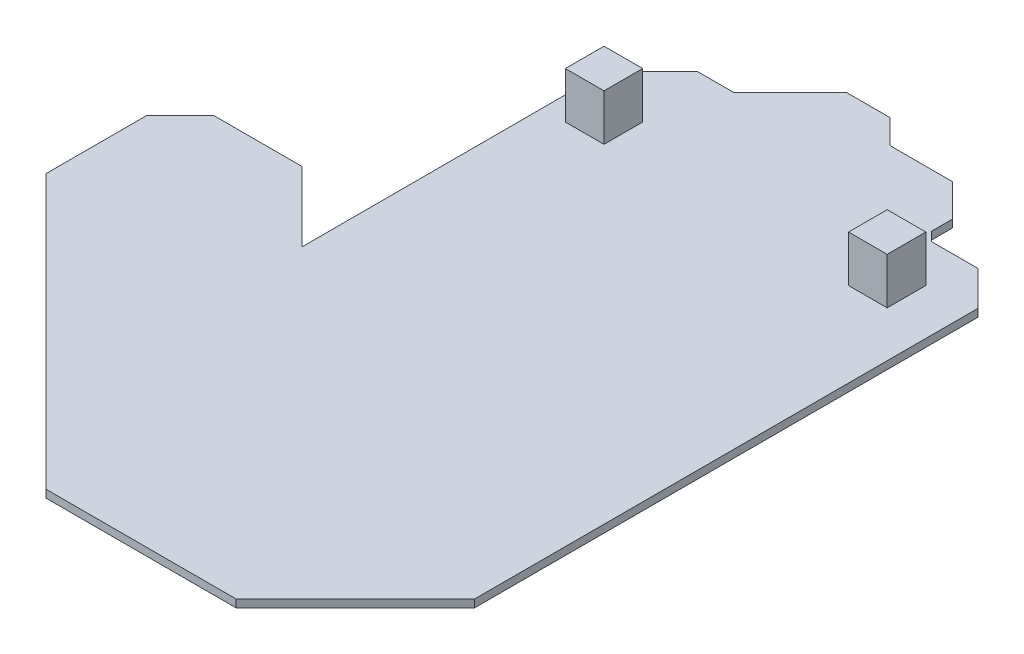
ISO-10303-21;
HEADER;
FILE_DESCRIPTION(('STEP AP214'),'2;1');
FILE_NAME('part.step','',(''),(''),'','','');
FILE_SCHEMA(('AUTOMOTIVE_DESIGN { 1 0 10303 214 1 1 1 1 }'));
ENDSEC;
DATA;
#1=APPLICATION_CONTEXT('core data for automotive mechanical design processes');
#2=APPLICATION_PROTOCOL_DEFINITION('international standard','automotive_design',2000,#1);
#3=PRODUCT_CONTEXT('',#1,'mechanical');
#4=PRODUCT('Part','Part','',(#3));
#5=PRODUCT_RELATED_PRODUCT_CATEGORY('part','',(#4));
#6=PRODUCT_DEFINITION_FORMATION('','',#4);
#7=PRODUCT_DEFINITION_CONTEXT('part definition',#1,'design');
#8=PRODUCT_DEFINITION('design','',#6,#7);
#9=PRODUCT_DEFINITION_SHAPE('','',#8);
#10=(LENGTH_UNIT() NAMED_UNIT(*) SI_UNIT(.MILLI.,.METRE.));
#11=(NAMED_UNIT(*) PLANE_ANGLE_UNIT() SI_UNIT($,.RADIAN.));
#12=(NAMED_UNIT(*) SI_UNIT($,.STERADIAN.) SOLID_ANGLE_UNIT());
#13=UNCERTAINTY_MEASURE_WITH_UNIT(LENGTH_MEASURE(1.E-05),#10,'distance_accuracy_value','');
#14=(GEOMETRIC_REPRESENTATION_CONTEXT(3) GLOBAL_UNCERTAINTY_ASSIGNED_CONTEXT((#13)) GLOBAL_UNIT_ASSIGNED_CONTEXT((#10,
#11,#12)) REPRESENTATION_CONTEXT('',''));
#15=CARTESIAN_POINT('',(0.,0.,0.));
#16=DIRECTION('',(0.,0.,1.));
#17=DIRECTION('',(1.,0.,0.));
#18=AXIS2_PLACEMENT_3D('',#15,#16,#17);
#19=CARTESIAN_POINT('',(0.,1.,0.));
#20=DIRECTION('',(0.,1.,0.));
#21=DIRECTION('',(0.,0.,1.));
#22=AXIS2_PLACEMENT_3D('',#19,#20,#21);
#23=PLANE('',#22);
#24=DIRECTION('',(0.,0.,1.));
#25=VECTOR('',#24,1.);
#26=CARTESIAN_POINT('',(-12.8081272215184,1.,-35.1234469127263));
#27=LINE('',#26,#25);
#28=CARTESIAN_POINT('',(-12.8081272215184,1.,-35.1234469127263));
#29=VERTEX_POINT('',#28);
#30=CARTESIAN_POINT('',(-12.8081272215184,1.,4.20448236548054));
#31=VERTEX_POINT('',#30);
#32=EDGE_CURVE('E301',#29,#31,#27,.T.);
#33=ORIENTED_EDGE('',*,*,#32,.T.);
#34=DIRECTION('',(-0.707106781186547,0.,-0.707106781186547));
#35=VECTOR('',#34,1.);
#36=CARTESIAN_POINT('',(-21.7959296410981,1.,-4.78332005409923));
#37=LINE('',#36,#35);
#38=CARTESIAN_POINT('',(-21.7959296410981,1.,-4.78332005409923));
#39=VERTEX_POINT('',#38);
#40=EDGE_CURVE('E305',#31,#39,#37,.T.);
#41=ORIENTED_EDGE('',*,*,#40,.T.);
#42=DIRECTION('',(-1.,0.,0.));
#43=VECTOR('',#42,1.);
#44=CARTESIAN_POINT('',(-33.2497198467111,1.,-4.78332005409923));
#45=LINE('',#44,#43);
#46=CARTESIAN_POINT('',(-33.2497198467111,1.,-4.78332005409923));
#47=VERTEX_POINT('',#46);
#48=EDGE_CURVE('E309',#39,#47,#45,.T.);
#49=ORIENTED_EDGE('',*,*,#48,.T.);
#50=DIRECTION('',(-0.707106781186548,0.,0.707106781186547));
#51=VECTOR('',#50,1.);
#52=CARTESIAN_POINT('',(-37.5858571976025,1.,-0.447182703207848));
#53=LINE('',#52,#51);
#54=CARTESIAN_POINT('',(-37.5858571976025,1.,-0.447182703207848));
#55=VERTEX_POINT('',#54);
#56=EDGE_CURVE('E312',#47,#55,#53,.T.);
#57=ORIENTED_EDGE('',*,*,#56,.T.);
#58=DIRECTION('',(0.,0.,1.));
#59=VECTOR('',#58,1.);
#60=CARTESIAN_POINT('',(-37.5858571976025,1.,12.5874570723393));
#61=LINE('',#60,#59);
#62=CARTESIAN_POINT('',(-37.5858571976025,1.,12.5874570723393));
#63=VERTEX_POINT('',#62);
#64=EDGE_CURVE('E315',#55,#63,#61,.T.);
#65=ORIENTED_EDGE('',*,*,#64,.T.);
#66=DIRECTION('',(0.707106781186547,0.,0.707106781186547));
#67=VECTOR('',#66,1.);
#68=CARTESIAN_POINT('',(-2.21140910452812,1.,47.9619051654137));
#69=LINE('',#68,#67);
#70=CARTESIAN_POINT('',(-2.21140910452812,1.,47.9619051654137));
#71=VERTEX_POINT('',#70);
#72=EDGE_CURVE('E318',#63,#71,#69,.T.);
#73=ORIENTED_EDGE('',*,*,#72,.T.);
#74=DIRECTION('',(1.,0.,0.));
#75=VECTOR('',#74,1.);
#76=CARTESIAN_POINT('',(22.3698693111261,1.,47.9619051654137));
#77=LINE('',#76,#75);
#78=CARTESIAN_POINT('',(22.3698693111261,1.,47.9619051654137));
#79=VERTEX_POINT('',#78);
#80=EDGE_CURVE('E321',#71,#79,#77,.T.);
#81=ORIENTED_EDGE('',*,*,#80,.T.);
#82=DIRECTION('',(0.707106781186547,0.,-0.707106781186548));
#83=VECTOR('',#82,1.);
#84=CARTESIAN_POINT('',(37.8255396426515,1.,32.5062348338882));
#85=LINE('',#84,#83);
#86=CARTESIAN_POINT('',(37.8255396426515,1.,32.5062348338882));
#87=VERTEX_POINT('',#86);
#88=EDGE_CURVE('E324',#79,#87,#85,.T.);
#89=ORIENTED_EDGE('',*,*,#88,.T.);
#90=DIRECTION('',(0.,0.,-1.));
#91=VECTOR('',#90,1.);
#92=CARTESIAN_POINT('',(37.8255396426515,1.,-32.6318772574283));
#93=LINE('',#92,#91);
#94=CARTESIAN_POINT('',(37.8255396426515,1.,-32.6318772574283));
#95=VERTEX_POINT('',#94);
#96=EDGE_CURVE('E327',#87,#95,#93,.T.);
#97=ORIENTED_EDGE('',*,*,#96,.T.);
#98=DIRECTION('',(-0.707106781186548,0.,-0.707106781186548));
#99=VECTOR('',#98,1.);
#100=CARTESIAN_POINT('',(33.3571241024083,1.,-37.1002927976715));
#101=LINE('',#100,#99);
#102=CARTESIAN_POINT('',(33.3571241024083,1.,-37.1002927976715));
#103=VERTEX_POINT('',#102);
#104=EDGE_CURVE('E330',#95,#103,#101,.T.);
#105=ORIENTED_EDGE('',*,*,#104,.T.);
#106=DIRECTION('',(-1.,0.,0.));
#107=VECTOR('',#106,1.);
#108=CARTESIAN_POINT('',(27.3503157601005,1.,-37.1002927976715));
#109=LINE('',#108,#107);
#110=CARTESIAN_POINT('',(27.3503157601005,1.,-37.1002927976715));
#111=VERTEX_POINT('',#110);
#112=EDGE_CURVE('E333',#103,#111,#109,.T.);
#113=ORIENTED_EDGE('',*,*,#112,.T.);
#114=DIRECTION('',(-0.707106781186548,0.,-0.707106781186548));
#115=VECTOR('',#114,1.);
#116=CARTESIAN_POINT('',(26.1749663652514,1.,-38.2756421925205));
#117=LINE('',#116,#115);
#118=CARTESIAN_POINT('',(26.1749663652514,1.,-38.2756421925205));
#119=VERTEX_POINT('',#118);
#120=EDGE_CURVE('E336',#111,#119,#117,.T.);
#121=ORIENTED_EDGE('',*,*,#120,.T.);
#122=DIRECTION('',(0.,0.,-1.));
#123=VECTOR('',#122,1.);
#124=CARTESIAN_POINT('',(26.1749663652514,1.,-40.9646260223668));
#125=LINE('',#124,#123);
#126=CARTESIAN_POINT('',(26.1749663652514,1.,-40.9646260223668));
#127=VERTEX_POINT('',#126);
#128=EDGE_CURVE('E339',#119,#127,#125,.T.);
#129=ORIENTED_EDGE('',*,*,#128,.T.);
#130=DIRECTION('',(-0.707106781186547,0.,-0.707106781186547));
#131=VECTOR('',#130,1.);
#132=CARTESIAN_POINT('',(21.9624292437838,1.,-45.1771631438344));
#133=LINE('',#132,#131);
#134=CARTESIAN_POINT('',(21.9624292437838,1.,-45.1771631438344));
#135=VERTEX_POINT('',#134);
#136=EDGE_CURVE('E342',#127,#135,#133,.T.);
#137=ORIENTED_EDGE('',*,*,#136,.T.);
#138=DIRECTION('',(-1.,0.,0.));
#139=VECTOR('',#138,1.);
#140=CARTESIAN_POINT('',(13.8722317068992,1.,-45.1771631438344));
#141=LINE('',#140,#139);
#142=CARTESIAN_POINT('',(13.8722317068992,1.,-45.1771631438344));
#143=VERTEX_POINT('',#142);
#144=EDGE_CURVE('E345',#135,#143,#141,.T.);
#145=ORIENTED_EDGE('',*,*,#144,.T.);
#146=DIRECTION('',(-0.707106781186547,0.,-0.707106781186547));
#147=VECTOR('',#146,1.);
#148=CARTESIAN_POINT('',(10.7336498927775,1.,-48.3157449579561));
#149=LINE('',#148,#147);
#150=CARTESIAN_POINT('',(10.7336498927775,1.,-48.3157449579561));
#151=VERTEX_POINT('',#150);
#152=EDGE_CURVE('E348',#143,#151,#149,.T.);
#153=ORIENTED_EDGE('',*,*,#152,.T.);
#154=DIRECTION('',(-1.,0.,0.));
#155=VECTOR('',#154,1.);
#156=CARTESIAN_POINT('',(5.11131920454483,1.,-48.3157449579561));
#157=LINE('',#156,#155);
#158=CARTESIAN_POINT('',(5.11131920454483,1.,-48.3157449579561));
#159=VERTEX_POINT('',#158);
#160=EDGE_CURVE('E351',#151,#159,#157,.T.);
#161=ORIENTED_EDGE('',*,*,#160,.T.);
#162=DIRECTION('',(-0.707106781186547,0.,0.707106781186548));
#163=VECTOR('',#162,1.);
#164=CARTESIAN_POINT('',(-2.18571472875728,1.,-41.018711024654));
#165=LINE('',#164,#163);
#166=CARTESIAN_POINT('',(-2.18571472875728,1.,-41.018711024654));
#167=VERTEX_POINT('',#166);
#168=EDGE_CURVE('E354',#159,#167,#165,.T.);
#169=ORIENTED_EDGE('',*,*,#168,.T.);
#170=DIRECTION('',(-1.,0.,0.));
#171=VECTOR('',#170,1.);
#172=CARTESIAN_POINT('',(-6.91286310959071,1.,-41.018711024654));
#173=LINE('',#172,#171);
#174=CARTESIAN_POINT('',(-6.91286310959071,1.,-41.018711024654));
#175=VERTEX_POINT('',#174);
#176=EDGE_CURVE('E357',#167,#175,#173,.T.);
#177=ORIENTED_EDGE('',*,*,#176,.T.);
#178=DIRECTION('',(-0.707106781186547,0.,0.707106781186548));
#179=VECTOR('',#178,1.);
#180=CARTESIAN_POINT('',(-12.8081272215184,1.,-35.1234469127263));
#181=LINE('',#180,#179);
#182=EDGE_CURVE('E360',#175,#29,#181,.T.);
#183=ORIENTED_EDGE('',*,*,#182,.T.);
#184=EDGE_LOOP('',(#33,#41,#49,#57,#65,#73,#81,#89,#97,#105,#113,#121,#129,#137,#145,#153,#161,
#169,#177,#183));
#185=FACE_BOUND('',#184,.T.);
#186=DIRECTION('',(-1.,0.,0.));
#187=VECTOR('',#186,1.);
#188=CARTESIAN_POINT('',(31.896408854725,1.,-31.8062828232328));
#189=LINE('',#188,#187);
#190=CARTESIAN_POINT('',(31.896408854725,1.,-31.8062828232328));
#191=VERTEX_POINT('',#190);
#192=CARTESIAN_POINT('',(26.896408854725,1.,-31.8062828232328));
#193=VERTEX_POINT('',#192);
#194=EDGE_CURVE('E261',#191,#193,#189,.T.);
#195=ORIENTED_EDGE('',*,*,#194,.F.);
#196=DIRECTION('',(0.,0.,-1.));
#197=VECTOR('',#196,1.);
#198=CARTESIAN_POINT('',(31.896408854725,1.,-31.8062828232328));
#199=LINE('',#198,#197);
#200=CARTESIAN_POINT('',(31.896408854725,1.,-26.8062828232328));
#201=VERTEX_POINT('',#200);
#202=EDGE_CURVE('E256',#201,#191,#199,.T.);
#203=ORIENTED_EDGE('',*,*,#202,.F.);
#204=DIRECTION('',(1.,0.,0.));
#205=VECTOR('',#204,1.);
#206=CARTESIAN_POINT('',(31.896408854725,1.,-26.8062828232328));
#207=LINE('',#206,#205);
#208=CARTESIAN_POINT('',(26.896408854725,1.,-26.8062828232328));
#209=VERTEX_POINT('',#208);
#210=EDGE_CURVE('E271',#209,#201,#207,.T.);
#211=ORIENTED_EDGE('',*,*,#210,.F.);
#212=DIRECTION('',(0.,0.,1.));
#213=VECTOR('',#212,1.);
#214=CARTESIAN_POINT('',(26.896408854725,1.,-31.8062828232328));
#215=LINE('',#214,#213);
#216=EDGE_CURVE('E283',#193,#209,#215,.T.);
#217=ORIENTED_EDGE('',*,*,#216,.F.);
#218=EDGE_LOOP('',(#195,#203,#211,#217));
#219=FACE_BOUND('',#218,.T.);
#220=DIRECTION('',(1.,0.,0.));
#221=VECTOR('',#220,1.);
#222=CARTESIAN_POINT('',(-9.75503598219518,1.,-26.8062828232328));
#223=LINE('',#222,#221);
#224=CARTESIAN_POINT('',(-9.75503598219518,1.,-26.8062828232328));
#225=VERTEX_POINT('',#224);
#226=CARTESIAN_POINT('',(-4.75503598219518,1.,-26.8062828232328));
#227=VERTEX_POINT('',#226);
#228=EDGE_CURVE('E871',#225,#227,#223,.T.);
#229=ORIENTED_EDGE('',*,*,#228,.F.);
#230=DIRECTION('',(0.,0.,1.));
#231=VECTOR('',#230,1.);
#232=CARTESIAN_POINT('',(-9.75503598219518,1.,-31.8062828232328));
#233=LINE('',#232,#231);
#234=CARTESIAN_POINT('',(-9.75503598219518,1.,-31.8062828232328));
#235=VERTEX_POINT('',#234);
#236=EDGE_CURVE('E253',#235,#225,#233,.T.);
#237=ORIENTED_EDGE('',*,*,#236,.F.);
#238=DIRECTION('',(-1.,0.,0.));
#239=VECTOR('',#238,1.);
#240=CARTESIAN_POINT('',(-9.75503598219518,1.,-31.8062828232328));
#241=LINE('',#240,#239);
#242=CARTESIAN_POINT('',(-4.75503598219518,1.,-31.8062828232328));
#243=VERTEX_POINT('',#242);
#244=EDGE_CURVE('E249',#243,#235,#241,.T.);
#245=ORIENTED_EDGE('',*,*,#244,.F.);
#246=DIRECTION('',(0.,0.,-1.));
#247=VECTOR('',#246,1.);
#248=CARTESIAN_POINT('',(-4.75503598219518,1.,-31.8062828232328));
#249=LINE('',#248,#247);
#250=EDGE_CURVE('E867',#227,#243,#249,.T.);
#251=ORIENTED_EDGE('',*,*,#250,.F.);
#252=EDGE_LOOP('',(#229,#237,#245,#251));
#253=FACE_BOUND('',#252,.T.);
#254=ADVANCED_FACE('F41',(#185,#219,#253),#23,.T.);
#255=CARTESIAN_POINT('',(-12.8081272215184,1.,-35.1234469127263));
#256=DIRECTION('',(1.,0.,0.));
#257=DIRECTION('',(0.,0.,-1.));
#258=AXIS2_PLACEMENT_3D('',#255,#256,#257);
#259=PLANE('',#258);
#260=DIRECTION('',(0.,0.,1.));
#261=VECTOR('',#260,1.);
#262=CARTESIAN_POINT('',(-12.8081272215184,0.,-35.1234469127263));
#263=LINE('',#262,#261);
#264=CARTESIAN_POINT('',(-12.8081272215184,0.,-35.1234469127263));
#265=VERTEX_POINT('',#264);
#266=CARTESIAN_POINT('',(-12.8081272215184,0.,4.20448236548054));
#267=VERTEX_POINT('',#266);
#268=EDGE_CURVE('E300',#265,#267,#263,.T.);
#269=ORIENTED_EDGE('',*,*,#268,.T.);
#270=DIRECTION('',(0.,-1.,0.));
#271=VECTOR('',#270,1.);
#272=CARTESIAN_POINT('',(-12.8081272215184,1.,4.20448236548054));
#273=LINE('',#272,#271);
#274=EDGE_CURVE('E11',#31,#267,#273,.T.);
#275=ORIENTED_EDGE('',*,*,#274,.F.);
#276=ORIENTED_EDGE('',*,*,#32,.F.);
#277=DIRECTION('',(0.,-1.,0.));
#278=VECTOR('',#277,1.);
#279=CARTESIAN_POINT('',(-12.8081272215184,1.,-35.1234469127263));
#280=LINE('',#279,#278);
#281=EDGE_CURVE('E363',#29,#265,#280,.T.);
#282=ORIENTED_EDGE('',*,*,#281,.T.);
#283=EDGE_LOOP('',(#269,#275,#276,#282));
#284=FACE_BOUND('',#283,.T.);
#285=ADVANCED_FACE('F43',(#284),#259,.F.);
#286=CARTESIAN_POINT('',(-21.7959296410981,1.,-4.78332005409923));
#287=DIRECTION('',(-0.707106781186547,0.,0.707106781186547));
#288=DIRECTION('',(0.707106781186548,0.,0.707106781186548));
#289=AXIS2_PLACEMENT_3D('',#286,#287,#288);
#290=PLANE('',#289);
#291=DIRECTION('',(-0.707106781186547,0.,-0.707106781186547));
#292=VECTOR('',#291,1.);
#293=CARTESIAN_POINT('',(-21.7959296410981,0.,-4.78332005409923));
#294=LINE('',#293,#292);
#295=CARTESIAN_POINT('',(-21.7959296410981,0.,-4.78332005409923));
#296=VERTEX_POINT('',#295);
#297=EDGE_CURVE('E367',#267,#296,#294,.T.);
#298=ORIENTED_EDGE('',*,*,#297,.T.);
#299=DIRECTION('',(0.,-1.,0.));
#300=VECTOR('',#299,1.);
#301=CARTESIAN_POINT('',(-21.7959296410981,1.,-4.78332005409923));
#302=LINE('',#301,#300);
#303=EDGE_CURVE('E50',#39,#296,#302,.T.);
#304=ORIENTED_EDGE('',*,*,#303,.F.);
#305=ORIENTED_EDGE('',*,*,#40,.F.);
#306=ORIENTED_EDGE('',*,*,#274,.T.);
#307=EDGE_LOOP('',(#298,#304,#305,#306));
#308=FACE_BOUND('',#307,.T.);
#309=ADVANCED_FACE('F522',(#308),#290,.F.);
#310=CARTESIAN_POINT('',(-33.2497198467111,1.,-4.78332005409923));
#311=DIRECTION('',(0.,0.,1.));
#312=DIRECTION('',(1.,0.,0.));
#313=AXIS2_PLACEMENT_3D('',#310,#311,#312);
#314=PLANE('',#313);
#315=DIRECTION('',(-1.,0.,0.));
#316=VECTOR('',#315,1.);
#317=CARTESIAN_POINT('',(-33.2497198467111,0.,-4.78332005409923));
#318=LINE('',#317,#316);
#319=CARTESIAN_POINT('',(-33.2497198467111,0.,-4.78332005409923));
#320=VERTEX_POINT('',#319);
#321=EDGE_CURVE('E370',#296,#320,#318,.T.);
#322=ORIENTED_EDGE('',*,*,#321,.T.);
#323=DIRECTION('',(0.,-1.,0.));
#324=VECTOR('',#323,1.);
#325=CARTESIAN_POINT('',(-33.2497198467111,1.,-4.78332005409923));
#326=LINE('',#325,#324);
#327=EDGE_CURVE('E490',#47,#320,#326,.T.);
#328=ORIENTED_EDGE('',*,*,#327,.F.);
#329=ORIENTED_EDGE('',*,*,#48,.F.);
#330=ORIENTED_EDGE('',*,*,#303,.T.);
#331=EDGE_LOOP('',(#322,#328,#329,#330));
#332=FACE_BOUND('',#331,.T.);
#333=ADVANCED_FACE('F499',(#332),#314,.F.);
#334=CARTESIAN_POINT('',(-37.5858571976025,1.,-0.447182703207848));
#335=DIRECTION('',(0.707106781186547,0.,0.707106781186548));
#336=DIRECTION('',(0.707106781186548,0.,-0.707106781186547));
#337=AXIS2_PLACEMENT_3D('',#334,#335,#336);
#338=PLANE('',#337);
#339=DIRECTION('',(-0.707106781186548,0.,0.707106781186547));
#340=VECTOR('',#339,1.);
#341=CARTESIAN_POINT('',(-37.5858571976025,0.,-0.447182703207848));
#342=LINE('',#341,#340);
#343=CARTESIAN_POINT('',(-37.5858571976025,0.,-0.447182703207848));
#344=VERTEX_POINT('',#343);
#345=EDGE_CURVE('E373',#320,#344,#342,.T.);
#346=ORIENTED_EDGE('',*,*,#345,.T.);
#347=DIRECTION('',(0.,-1.,0.));
#348=VECTOR('',#347,1.);
#349=CARTESIAN_POINT('',(-37.5858571976025,1.,-0.447182703207848));
#350=LINE('',#349,#348);
#351=EDGE_CURVE('E486',#55,#344,#350,.T.);
#352=ORIENTED_EDGE('',*,*,#351,.F.);
#353=ORIENTED_EDGE('',*,*,#56,.F.);
#354=ORIENTED_EDGE('',*,*,#327,.T.);
#355=EDGE_LOOP('',(#346,#352,#353,#354));
#356=FACE_BOUND('',#355,.T.);
#357=ADVANCED_FACE('F510',(#356),#338,.F.);
#358=CARTESIAN_POINT('',(-37.5858571976025,1.,12.5874570723393));
#359=DIRECTION('',(1.,0.,0.));
#360=DIRECTION('',(0.,0.,-1.));
#361=AXIS2_PLACEMENT_3D('',#358,#359,#360);
#362=PLANE('',#361);
#363=DIRECTION('',(0.,0.,1.));
#364=VECTOR('',#363,1.);
#365=CARTESIAN_POINT('',(-37.5858571976025,0.,12.5874570723393));
#366=LINE('',#365,#364);
#367=CARTESIAN_POINT('',(-37.5858571976025,0.,12.5874570723393));
#368=VERTEX_POINT('',#367);
#369=EDGE_CURVE('E376',#344,#368,#366,.T.);
#370=ORIENTED_EDGE('',*,*,#369,.T.);
#371=DIRECTION('',(0.,-1.,0.));
#372=VECTOR('',#371,1.);
#373=CARTESIAN_POINT('',(-37.5858571976025,1.,12.5874570723393));
#374=LINE('',#373,#372);
#375=EDGE_CURVE('E482',#63,#368,#374,.T.);
#376=ORIENTED_EDGE('',*,*,#375,.F.);
#377=ORIENTED_EDGE('',*,*,#64,.F.);
#378=ORIENTED_EDGE('',*,*,#351,.T.);
#379=EDGE_LOOP('',(#370,#376,#377,#378));
#380=FACE_BOUND('',#379,.T.);
#381=ADVANCED_FACE('F514',(#380),#362,.F.);
#382=CARTESIAN_POINT('',(-2.21140910452812,1.,47.9619051654137));
#383=DIRECTION('',(0.707106781186547,0.,-0.707106781186547));
#384=DIRECTION('',(-0.707106781186548,0.,-0.707106781186548));
#385=AXIS2_PLACEMENT_3D('',#382,#383,#384);
#386=PLANE('',#385);
#387=DIRECTION('',(0.707106781186547,0.,0.707106781186547));
#388=VECTOR('',#387,1.);
#389=CARTESIAN_POINT('',(-2.21140910452812,0.,47.9619051654137));
#390=LINE('',#389,#388);
#391=CARTESIAN_POINT('',(-2.21140910452812,0.,47.9619051654137));
#392=VERTEX_POINT('',#391);
#393=EDGE_CURVE('E379',#368,#392,#390,.T.);
#394=ORIENTED_EDGE('',*,*,#393,.T.);
#395=DIRECTION('',(0.,-1.,0.));
#396=VECTOR('',#395,1.);
#397=CARTESIAN_POINT('',(-2.21140910452812,1.,47.9619051654137));
#398=LINE('',#397,#396);
#399=EDGE_CURVE('E478',#71,#392,#398,.T.);
#400=ORIENTED_EDGE('',*,*,#399,.F.);
#401=ORIENTED_EDGE('',*,*,#72,.F.);
#402=ORIENTED_EDGE('',*,*,#375,.T.);
#403=EDGE_LOOP('',(#394,#400,#401,#402));
#404=FACE_BOUND('',#403,.T.);
#405=ADVANCED_FACE('F595',(#404),#386,.F.);
#406=CARTESIAN_POINT('',(22.3698693111261,1.,47.9619051654137));
#407=DIRECTION('',(0.,0.,-1.));
#408=DIRECTION('',(-1.,0.,0.));
#409=AXIS2_PLACEMENT_3D('',#406,#407,#408);
#410=PLANE('',#409);
#411=DIRECTION('',(1.,0.,0.));
#412=VECTOR('',#411,1.);
#413=CARTESIAN_POINT('',(22.3698693111261,0.,47.9619051654137));
#414=LINE('',#413,#412);
#415=CARTESIAN_POINT('',(22.3698693111261,0.,47.9619051654137));
#416=VERTEX_POINT('',#415);
#417=EDGE_CURVE('E382',#392,#416,#414,.T.);
#418=ORIENTED_EDGE('',*,*,#417,.T.);
#419=DIRECTION('',(0.,-1.,0.));
#420=VECTOR('',#419,1.);
#421=CARTESIAN_POINT('',(22.3698693111261,1.,47.9619051654137));
#422=LINE('',#421,#420);
#423=EDGE_CURVE('E474',#79,#416,#422,.T.);
#424=ORIENTED_EDGE('',*,*,#423,.F.);
#425=ORIENTED_EDGE('',*,*,#80,.F.);
#426=ORIENTED_EDGE('',*,*,#399,.T.);
#427=EDGE_LOOP('',(#418,#424,#425,#426));
#428=FACE_BOUND('',#427,.T.);
#429=ADVANCED_FACE('F593',(#428),#410,.F.);
#430=CARTESIAN_POINT('',(37.8255396426515,1.,32.5062348338882));
#431=DIRECTION('',(-0.707106781186548,0.,-0.707106781186547));
#432=DIRECTION('',(-0.707106781186547,0.,0.707106781186548));
#433=AXIS2_PLACEMENT_3D('',#430,#431,#432);
#434=PLANE('',#433);
#435=DIRECTION('',(0.707106781186547,0.,-0.707106781186548));
#436=VECTOR('',#435,1.);
#437=CARTESIAN_POINT('',(37.8255396426515,0.,32.5062348338882));
#438=LINE('',#437,#436);
#439=CARTESIAN_POINT('',(37.8255396426515,0.,32.5062348338882));
#440=VERTEX_POINT('',#439);
#441=EDGE_CURVE('E385',#416,#440,#438,.T.);
#442=ORIENTED_EDGE('',*,*,#441,.T.);
#443=DIRECTION('',(0.,-1.,0.));
#444=VECTOR('',#443,1.);
#445=CARTESIAN_POINT('',(37.8255396426515,1.,32.5062348338882));
#446=LINE('',#445,#444);
#447=EDGE_CURVE('E470',#87,#440,#446,.T.);
#448=ORIENTED_EDGE('',*,*,#447,.F.);
#449=ORIENTED_EDGE('',*,*,#88,.F.);
#450=ORIENTED_EDGE('',*,*,#423,.T.);
#451=EDGE_LOOP('',(#442,#448,#449,#450));
#452=FACE_BOUND('',#451,.T.);
#453=ADVANCED_FACE('F588',(#452),#434,.F.);
#454=CARTESIAN_POINT('',(37.8255396426515,1.,-32.6318772574283));
#455=DIRECTION('',(-1.,0.,0.));
#456=DIRECTION('',(0.,0.,1.));
#457=AXIS2_PLACEMENT_3D('',#454,#455,#456);
#458=PLANE('',#457);
#459=DIRECTION('',(0.,0.,-1.));
#460=VECTOR('',#459,1.);
#461=CARTESIAN_POINT('',(37.8255396426515,0.,-32.6318772574283));
#462=LINE('',#461,#460);
#463=CARTESIAN_POINT('',(37.8255396426515,0.,-32.6318772574283));
#464=VERTEX_POINT('',#463);
#465=EDGE_CURVE('E388',#440,#464,#462,.T.);
#466=ORIENTED_EDGE('',*,*,#465,.T.);
#467=DIRECTION('',(0.,-1.,0.));
#468=VECTOR('',#467,1.);
#469=CARTESIAN_POINT('',(37.8255396426515,1.,-32.6318772574283));
#470=LINE('',#469,#468);
#471=EDGE_CURVE('E466',#95,#464,#470,.T.);
#472=ORIENTED_EDGE('',*,*,#471,.F.);
#473=ORIENTED_EDGE('',*,*,#96,.F.);
#474=ORIENTED_EDGE('',*,*,#447,.T.);
#475=EDGE_LOOP('',(#466,#472,#473,#474));
#476=FACE_BOUND('',#475,.T.);
#477=ADVANCED_FACE('F583',(#476),#458,.F.);
#478=CARTESIAN_POINT('',(33.3571241024083,1.,-37.1002927976715));
#479=DIRECTION('',(-0.707106781186547,0.,0.707106781186547));
#480=DIRECTION('',(0.707106781186548,0.,0.707106781186548));
#481=AXIS2_PLACEMENT_3D('',#478,#479,#480);
#482=PLANE('',#481);
#483=DIRECTION('',(-0.707106781186548,0.,-0.707106781186548));
#484=VECTOR('',#483,1.);
#485=CARTESIAN_POINT('',(33.3571241024083,0.,-37.1002927976715));
#486=LINE('',#485,#484);
#487=CARTESIAN_POINT('',(33.3571241024083,0.,-37.1002927976715));
#488=VERTEX_POINT('',#487);
#489=EDGE_CURVE('E391',#464,#488,#486,.T.);
#490=ORIENTED_EDGE('',*,*,#489,.T.);
#491=DIRECTION('',(0.,-1.,0.));
#492=VECTOR('',#491,1.);
#493=CARTESIAN_POINT('',(33.3571241024083,1.,-37.1002927976715));
#494=LINE('',#493,#492);
#495=EDGE_CURVE('E462',#103,#488,#494,.T.);
#496=ORIENTED_EDGE('',*,*,#495,.F.);
#497=ORIENTED_EDGE('',*,*,#104,.F.);
#498=ORIENTED_EDGE('',*,*,#471,.T.);
#499=EDGE_LOOP('',(#490,#496,#497,#498));
#500=FACE_BOUND('',#499,.T.);
#501=ADVANCED_FACE('F579',(#500),#482,.F.);
#502=CARTESIAN_POINT('',(27.3503157601005,1.,-37.1002927976715));
#503=DIRECTION('',(0.,0.,1.));
#504=DIRECTION('',(1.,0.,0.));
#505=AXIS2_PLACEMENT_3D('',#502,#503,#504);
#506=PLANE('',#505);
#507=DIRECTION('',(-1.,0.,0.));
#508=VECTOR('',#507,1.);
#509=CARTESIAN_POINT('',(27.3503157601005,0.,-37.1002927976715));
#510=LINE('',#509,#508);
#511=CARTESIAN_POINT('',(27.3503157601005,0.,-37.1002927976715));
#512=VERTEX_POINT('',#511);
#513=EDGE_CURVE('E394',#488,#512,#510,.T.);
#514=ORIENTED_EDGE('',*,*,#513,.T.);
#515=DIRECTION('',(0.,-1.,0.));
#516=VECTOR('',#515,1.);
#517=CARTESIAN_POINT('',(27.3503157601005,1.,-37.1002927976715));
#518=LINE('',#517,#516);
#519=EDGE_CURVE('E458',#111,#512,#518,.T.);
#520=ORIENTED_EDGE('',*,*,#519,.F.);
#521=ORIENTED_EDGE('',*,*,#112,.F.);
#522=ORIENTED_EDGE('',*,*,#495,.T.);
#523=EDGE_LOOP('',(#514,#520,#521,#522));
#524=FACE_BOUND('',#523,.T.);
#525=ADVANCED_FACE('F574',(#524),#506,.F.);
#526=CARTESIAN_POINT('',(26.1749663652514,1.,-38.2756421925205));
#527=DIRECTION('',(-0.707106781186547,0.,0.707106781186547));
#528=DIRECTION('',(0.707106781186548,0.,0.707106781186548));
#529=AXIS2_PLACEMENT_3D('',#526,#527,#528);
#530=PLANE('',#529);
#531=DIRECTION('',(-0.707106781186548,0.,-0.707106781186548));
#532=VECTOR('',#531,1.);
#533=CARTESIAN_POINT('',(26.1749663652514,0.,-38.2756421925205));
#534=LINE('',#533,#532);
#535=CARTESIAN_POINT('',(26.1749663652514,0.,-38.2756421925205));
#536=VERTEX_POINT('',#535);
#537=EDGE_CURVE('E397',#512,#536,#534,.T.);
#538=ORIENTED_EDGE('',*,*,#537,.T.);
#539=DIRECTION('',(0.,-1.,0.));
#540=VECTOR('',#539,1.);
#541=CARTESIAN_POINT('',(26.1749663652514,1.,-38.2756421925205));
#542=LINE('',#541,#540);
#543=EDGE_CURVE('E454',#119,#536,#542,.T.);
#544=ORIENTED_EDGE('',*,*,#543,.F.);
#545=ORIENTED_EDGE('',*,*,#120,.F.);
#546=ORIENTED_EDGE('',*,*,#519,.T.);
#547=EDGE_LOOP('',(#538,#544,#545,#546));
#548=FACE_BOUND('',#547,.T.);
#549=ADVANCED_FACE('F568',(#548),#530,.F.);
#550=CARTESIAN_POINT('',(26.1749663652514,1.,-40.9646260223668));
#551=DIRECTION('',(-1.,0.,0.));
#552=DIRECTION('',(0.,0.,1.));
#553=AXIS2_PLACEMENT_3D('',#550,#551,#552);
#554=PLANE('',#553);
#555=DIRECTION('',(0.,0.,-1.));
#556=VECTOR('',#555,1.);
#557=CARTESIAN_POINT('',(26.1749663652514,0.,-40.9646260223668));
#558=LINE('',#557,#556);
#559=CARTESIAN_POINT('',(26.1749663652514,0.,-40.9646260223668));
#560=VERTEX_POINT('',#559);
#561=EDGE_CURVE('E400',#536,#560,#558,.T.);
#562=ORIENTED_EDGE('',*,*,#561,.T.);
#563=DIRECTION('',(0.,-1.,0.));
#564=VECTOR('',#563,1.);
#565=CARTESIAN_POINT('',(26.1749663652514,1.,-40.9646260223668));
#566=LINE('',#565,#564);
#567=EDGE_CURVE('E450',#127,#560,#566,.T.);
#568=ORIENTED_EDGE('',*,*,#567,.F.);
#569=ORIENTED_EDGE('',*,*,#128,.F.);
#570=ORIENTED_EDGE('',*,*,#543,.T.);
#571=EDGE_LOOP('',(#562,#568,#569,#570));
#572=FACE_BOUND('',#571,.T.);
#573=ADVANCED_FACE('F564',(#572),#554,.F.);
#574=CARTESIAN_POINT('',(21.9624292437838,1.,-45.1771631438344));
#575=DIRECTION('',(-0.707106781186547,0.,0.707106781186547));
#576=DIRECTION('',(0.707106781186548,0.,0.707106781186548));
#577=AXIS2_PLACEMENT_3D('',#574,#575,#576);
#578=PLANE('',#577);
#579=DIRECTION('',(-0.707106781186547,0.,-0.707106781186547));
#580=VECTOR('',#579,1.);
#581=CARTESIAN_POINT('',(21.9624292437838,0.,-45.1771631438344));
#582=LINE('',#581,#580);
#583=CARTESIAN_POINT('',(21.9624292437838,0.,-45.1771631438344));
#584=VERTEX_POINT('',#583);
#585=EDGE_CURVE('E403',#560,#584,#582,.T.);
#586=ORIENTED_EDGE('',*,*,#585,.T.);
#587=DIRECTION('',(0.,-1.,0.));
#588=VECTOR('',#587,1.);
#589=CARTESIAN_POINT('',(21.9624292437838,1.,-45.1771631438344));
#590=LINE('',#589,#588);
#591=EDGE_CURVE('E446',#135,#584,#590,.T.);
#592=ORIENTED_EDGE('',*,*,#591,.F.);
#593=ORIENTED_EDGE('',*,*,#136,.F.);
#594=ORIENTED_EDGE('',*,*,#567,.T.);
#595=EDGE_LOOP('',(#586,#592,#593,#594));
#596=FACE_BOUND('',#595,.T.);
#597=ADVANCED_FACE('F559',(#596),#578,.F.);
#598=CARTESIAN_POINT('',(13.8722317068992,1.,-45.1771631438344));
#599=DIRECTION('',(0.,0.,1.));
#600=DIRECTION('',(1.,0.,0.));
#601=AXIS2_PLACEMENT_3D('',#598,#599,#600);
#602=PLANE('',#601);
#603=DIRECTION('',(-1.,0.,0.));
#604=VECTOR('',#603,1.);
#605=CARTESIAN_POINT('',(13.8722317068992,0.,-45.1771631438344));
#606=LINE('',#605,#604);
#607=CARTESIAN_POINT('',(13.8722317068992,0.,-45.1771631438344));
#608=VERTEX_POINT('',#607);
#609=EDGE_CURVE('E406',#584,#608,#606,.T.);
#610=ORIENTED_EDGE('',*,*,#609,.T.);
#611=DIRECTION('',(0.,-1.,0.));
#612=VECTOR('',#611,1.);
#613=CARTESIAN_POINT('',(13.8722317068992,1.,-45.1771631438344));
#614=LINE('',#613,#612);
#615=EDGE_CURVE('E442',#143,#608,#614,.T.);
#616=ORIENTED_EDGE('',*,*,#615,.F.);
#617=ORIENTED_EDGE('',*,*,#144,.F.);
#618=ORIENTED_EDGE('',*,*,#591,.T.);
#619=EDGE_LOOP('',(#610,#616,#617,#618));
#620=FACE_BOUND('',#619,.T.);
#621=ADVANCED_FACE('F553',(#620),#602,.F.);
#622=CARTESIAN_POINT('',(10.7336498927775,1.,-48.3157449579561));
#623=DIRECTION('',(-0.707106781186547,0.,0.707106781186547));
#624=DIRECTION('',(0.707106781186548,0.,0.707106781186548));
#625=AXIS2_PLACEMENT_3D('',#622,#623,#624);
#626=PLANE('',#625);
#627=DIRECTION('',(-0.707106781186547,0.,-0.707106781186547));
#628=VECTOR('',#627,1.);
#629=CARTESIAN_POINT('',(10.7336498927775,0.,-48.3157449579561));
#630=LINE('',#629,#628);
#631=CARTESIAN_POINT('',(10.7336498927775,0.,-48.3157449579561));
#632=VERTEX_POINT('',#631);
#633=EDGE_CURVE('E409',#608,#632,#630,.T.);
#634=ORIENTED_EDGE('',*,*,#633,.T.);
#635=DIRECTION('',(0.,-1.,0.));
#636=VECTOR('',#635,1.);
#637=CARTESIAN_POINT('',(10.7336498927775,1.,-48.3157449579561));
#638=LINE('',#637,#636);
#639=EDGE_CURVE('E438',#151,#632,#638,.T.);
#640=ORIENTED_EDGE('',*,*,#639,.F.);
#641=ORIENTED_EDGE('',*,*,#152,.F.);
#642=ORIENTED_EDGE('',*,*,#615,.T.);
#643=EDGE_LOOP('',(#634,#640,#641,#642));
#644=FACE_BOUND('',#643,.T.);
#645=ADVANCED_FACE('F549',(#644),#626,.F.);
#646=CARTESIAN_POINT('',(5.11131920454483,1.,-48.3157449579561));
#647=DIRECTION('',(0.,0.,1.));
#648=DIRECTION('',(1.,0.,0.));
#649=AXIS2_PLACEMENT_3D('',#646,#647,#648);
#650=PLANE('',#649);
#651=DIRECTION('',(-1.,0.,0.));
#652=VECTOR('',#651,1.);
#653=CARTESIAN_POINT('',(5.11131920454483,0.,-48.3157449579561));
#654=LINE('',#653,#652);
#655=CARTESIAN_POINT('',(5.11131920454483,0.,-48.3157449579561));
#656=VERTEX_POINT('',#655);
#657=EDGE_CURVE('E412',#632,#656,#654,.T.);
#658=ORIENTED_EDGE('',*,*,#657,.T.);
#659=DIRECTION('',(0.,-1.,0.));
#660=VECTOR('',#659,1.);
#661=CARTESIAN_POINT('',(5.11131920454483,1.,-48.3157449579561));
#662=LINE('',#661,#660);
#663=EDGE_CURVE('E434',#159,#656,#662,.T.);
#664=ORIENTED_EDGE('',*,*,#663,.F.);
#665=ORIENTED_EDGE('',*,*,#160,.F.);
#666=ORIENTED_EDGE('',*,*,#639,.T.);
#667=EDGE_LOOP('',(#658,#664,#665,#666));
#668=FACE_BOUND('',#667,.T.);
#669=ADVANCED_FACE('F544',(#668),#650,.F.);
#670=CARTESIAN_POINT('',(-2.18571472875728,1.,-41.018711024654));
#671=DIRECTION('',(0.707106781186548,0.,0.707106781186547));
#672=DIRECTION('',(0.707106781186547,0.,-0.707106781186548));
#673=AXIS2_PLACEMENT_3D('',#670,#671,#672);
#674=PLANE('',#673);
#675=DIRECTION('',(-0.707106781186547,0.,0.707106781186548));
#676=VECTOR('',#675,1.);
#677=CARTESIAN_POINT('',(-2.18571472875728,0.,-41.018711024654));
#678=LINE('',#677,#676);
#679=CARTESIAN_POINT('',(-2.18571472875728,0.,-41.018711024654));
#680=VERTEX_POINT('',#679);
#681=EDGE_CURVE('E415',#656,#680,#678,.T.);
#682=ORIENTED_EDGE('',*,*,#681,.T.);
#683=DIRECTION('',(0.,-1.,0.));
#684=VECTOR('',#683,1.);
#685=CARTESIAN_POINT('',(-2.18571472875728,1.,-41.018711024654));
#686=LINE('',#685,#684);
#687=EDGE_CURVE('E430',#167,#680,#686,.T.);
#688=ORIENTED_EDGE('',*,*,#687,.F.);
#689=ORIENTED_EDGE('',*,*,#168,.F.);
#690=ORIENTED_EDGE('',*,*,#663,.T.);
#691=EDGE_LOOP('',(#682,#688,#689,#690));
#692=FACE_BOUND('',#691,.T.);
#693=ADVANCED_FACE('F538',(#692),#674,.F.);
#694=CARTESIAN_POINT('',(-6.91286310959071,1.,-41.018711024654));
#695=DIRECTION('',(0.,0.,1.));
#696=DIRECTION('',(1.,0.,0.));
#697=AXIS2_PLACEMENT_3D('',#694,#695,#696);
#698=PLANE('',#697);
#699=DIRECTION('',(-1.,0.,0.));
#700=VECTOR('',#699,1.);
#701=CARTESIAN_POINT('',(-6.91286310959071,0.,-41.018711024654));
#702=LINE('',#701,#700);
#703=CARTESIAN_POINT('',(-6.91286310959071,0.,-41.018711024654));
#704=VERTEX_POINT('',#703);
#705=EDGE_CURVE('E418',#680,#704,#702,.T.);
#706=ORIENTED_EDGE('',*,*,#705,.T.);
#707=DIRECTION('',(0.,-1.,0.));
#708=VECTOR('',#707,1.);
#709=CARTESIAN_POINT('',(-6.91286310959071,1.,-41.018711024654));
#710=LINE('',#709,#708);
#711=EDGE_CURVE('E426',#175,#704,#710,.T.);
#712=ORIENTED_EDGE('',*,*,#711,.F.);
#713=ORIENTED_EDGE('',*,*,#176,.F.);
#714=ORIENTED_EDGE('',*,*,#687,.T.);
#715=EDGE_LOOP('',(#706,#712,#713,#714));
#716=FACE_BOUND('',#715,.T.);
#717=ADVANCED_FACE('F534',(#716),#698,.F.);
#718=CARTESIAN_POINT('',(-12.8081272215184,1.,-35.1234469127263));
#719=DIRECTION('',(0.707106781186548,0.,0.707106781186547));
#720=DIRECTION('',(0.707106781186547,0.,-0.707106781186548));
#721=AXIS2_PLACEMENT_3D('',#718,#719,#720);
#722=PLANE('',#721);
#723=DIRECTION('',(-0.707106781186547,0.,0.707106781186548));
#724=VECTOR('',#723,1.);
#725=CARTESIAN_POINT('',(-12.8081272215184,0.,-35.1234469127263));
#726=LINE('',#725,#724);
#727=EDGE_CURVE('E306',#704,#265,#726,.T.);
#728=ORIENTED_EDGE('',*,*,#727,.T.);
#729=ORIENTED_EDGE('',*,*,#281,.F.);
#730=ORIENTED_EDGE('',*,*,#182,.F.);
#731=ORIENTED_EDGE('',*,*,#711,.T.);
#732=EDGE_LOOP('',(#728,#729,#730,#731));
#733=FACE_BOUND('',#732,.T.);
#734=ADVANCED_FACE('F529',(#733),#722,.F.);
#735=CARTESIAN_POINT('',(0.,0.,0.));
#736=DIRECTION('',(0.,1.,0.));
#737=DIRECTION('',(0.,0.,1.));
#738=AXIS2_PLACEMENT_3D('',#735,#736,#737);
#739=PLANE('',#738);
#740=ORIENTED_EDGE('',*,*,#268,.F.);
#741=ORIENTED_EDGE('',*,*,#727,.F.);
#742=ORIENTED_EDGE('',*,*,#705,.F.);
#743=ORIENTED_EDGE('',*,*,#681,.F.);
#744=ORIENTED_EDGE('',*,*,#657,.F.);
#745=ORIENTED_EDGE('',*,*,#633,.F.);
#746=ORIENTED_EDGE('',*,*,#609,.F.);
#747=ORIENTED_EDGE('',*,*,#585,.F.);
#748=ORIENTED_EDGE('',*,*,#561,.F.);
#749=ORIENTED_EDGE('',*,*,#537,.F.);
#750=ORIENTED_EDGE('',*,*,#513,.F.);
#751=ORIENTED_EDGE('',*,*,#489,.F.);
#752=ORIENTED_EDGE('',*,*,#465,.F.);
#753=ORIENTED_EDGE('',*,*,#441,.F.);
#754=ORIENTED_EDGE('',*,*,#417,.F.);
#755=ORIENTED_EDGE('',*,*,#393,.F.);
#756=ORIENTED_EDGE('',*,*,#369,.F.);
#757=ORIENTED_EDGE('',*,*,#345,.F.);
#758=ORIENTED_EDGE('',*,*,#321,.F.);
#759=ORIENTED_EDGE('',*,*,#297,.F.);
#760=EDGE_LOOP('',(#740,#741,#742,#743,#744,#745,#746,#747,#748,#749,#750,#751,#752,#753,#754,
#755,#756,#757,#758,#759));
#761=FACE_BOUND('',#760,.T.);
#762=ADVANCED_FACE('F505',(#761),#739,.F.);
#763=CARTESIAN_POINT('',(31.896408854725,7.,-31.8062828232328));
#764=DIRECTION('',(-1.,0.,0.));
#765=DIRECTION('',(0.,0.,1.));
#766=AXIS2_PLACEMENT_3D('',#763,#764,#765);
#767=PLANE('',#766);
#768=ORIENTED_EDGE('',*,*,#202,.T.);
#769=DIRECTION('',(0.,-1.,0.));
#770=VECTOR('',#769,1.);
#771=CARTESIAN_POINT('',(31.896408854725,7.,-31.8062828232328));
#772=LINE('',#771,#770);
#773=CARTESIAN_POINT('',(31.896408854725,7.,-31.8062828232328));
#774=VERTEX_POINT('',#773);
#775=EDGE_CURVE('E297',#774,#191,#772,.T.);
#776=ORIENTED_EDGE('',*,*,#775,.F.);
#777=DIRECTION('',(0.,0.,-1.));
#778=VECTOR('',#777,1.);
#779=CARTESIAN_POINT('',(31.896408854725,7.,-31.8062828232328));
#780=LINE('',#779,#778);
#781=CARTESIAN_POINT('',(31.896408854725,7.,-26.8062828232328));
#782=VERTEX_POINT('',#781);
#783=EDGE_CURVE('E266',#782,#774,#780,.T.);
#784=ORIENTED_EDGE('',*,*,#783,.F.);
#785=DIRECTION('',(0.,-1.,0.));
#786=VECTOR('',#785,1.);
#787=CARTESIAN_POINT('',(31.896408854725,7.,-26.8062828232328));
#788=LINE('',#787,#786);
#789=EDGE_CURVE('E279',#782,#201,#788,.T.);
#790=ORIENTED_EDGE('',*,*,#789,.T.);
#791=EDGE_LOOP('',(#768,#776,#784,#790));
#792=FACE_BOUND('',#791,.T.);
#793=ADVANCED_FACE('F611',(#792),#767,.F.);
#794=CARTESIAN_POINT('',(31.896408854725,7.,-31.8062828232328));
#795=DIRECTION('',(0.,0.,1.));
#796=DIRECTION('',(1.,0.,0.));
#797=AXIS2_PLACEMENT_3D('',#794,#795,#796);
#798=PLANE('',#797);
#799=ORIENTED_EDGE('',*,*,#194,.T.);
#800=DIRECTION('',(0.,-1.,0.));
#801=VECTOR('',#800,1.);
#802=CARTESIAN_POINT('',(26.896408854725,7.,-31.8062828232328));
#803=LINE('',#802,#801);
#804=CARTESIAN_POINT('',(26.896408854725,7.,-31.8062828232328));
#805=VERTEX_POINT('',#804);
#806=EDGE_CURVE('E293',#805,#193,#803,.T.);
#807=ORIENTED_EDGE('',*,*,#806,.F.);
#808=DIRECTION('',(-1.,0.,0.));
#809=VECTOR('',#808,1.);
#810=CARTESIAN_POINT('',(31.896408854725,7.,-31.8062828232328));
#811=LINE('',#810,#809);
#812=EDGE_CURVE('E270',#774,#805,#811,.T.);
#813=ORIENTED_EDGE('',*,*,#812,.F.);
#814=ORIENTED_EDGE('',*,*,#775,.T.);
#815=EDGE_LOOP('',(#799,#807,#813,#814));
#816=FACE_BOUND('',#815,.T.);
#817=ADVANCED_FACE('F702',(#816),#798,.F.);
#818=CARTESIAN_POINT('',(26.896408854725,7.,-31.8062828232328));
#819=DIRECTION('',(1.,0.,0.));
#820=DIRECTION('',(0.,0.,-1.));
#821=AXIS2_PLACEMENT_3D('',#818,#819,#820);
#822=PLANE('',#821);
#823=ORIENTED_EDGE('',*,*,#216,.T.);
#824=DIRECTION('',(0.,-1.,0.));
#825=VECTOR('',#824,1.);
#826=CARTESIAN_POINT('',(26.896408854725,7.,-26.8062828232328));
#827=LINE('',#826,#825);
#828=CARTESIAN_POINT('',(26.896408854725,7.,-26.8062828232328));
#829=VERTEX_POINT('',#828);
#830=EDGE_CURVE('E65',#829,#209,#827,.T.);
#831=ORIENTED_EDGE('',*,*,#830,.F.);
#832=DIRECTION('',(0.,0.,1.));
#833=VECTOR('',#832,1.);
#834=CARTESIAN_POINT('',(26.896408854725,7.,-31.8062828232328));
#835=LINE('',#834,#833);
#836=EDGE_CURVE('E274',#805,#829,#835,.T.);
#837=ORIENTED_EDGE('',*,*,#836,.F.);
#838=ORIENTED_EDGE('',*,*,#806,.T.);
#839=EDGE_LOOP('',(#823,#831,#837,#838));
#840=FACE_BOUND('',#839,.T.);
#841=ADVANCED_FACE('F709',(#840),#822,.F.);
#842=CARTESIAN_POINT('',(31.896408854725,7.,-26.8062828232328));
#843=DIRECTION('',(0.,0.,-1.));
#844=DIRECTION('',(-1.,0.,0.));
#845=AXIS2_PLACEMENT_3D('',#842,#843,#844);
#846=PLANE('',#845);
#847=ORIENTED_EDGE('',*,*,#210,.T.);
#848=ORIENTED_EDGE('',*,*,#789,.F.);
#849=DIRECTION('',(1.,0.,0.));
#850=VECTOR('',#849,1.);
#851=CARTESIAN_POINT('',(31.896408854725,7.,-26.8062828232328));
#852=LINE('',#851,#850);
#853=EDGE_CURVE('E277',#829,#782,#852,.T.);
#854=ORIENTED_EDGE('',*,*,#853,.F.);
#855=ORIENTED_EDGE('',*,*,#830,.T.);
#856=EDGE_LOOP('',(#847,#848,#854,#855));
#857=FACE_BOUND('',#856,.T.);
#858=ADVANCED_FACE('F716',(#857),#846,.F.);
#859=CARTESIAN_POINT('',(0.,7.,0.));
#860=DIRECTION('',(0.,-1.,0.));
#861=DIRECTION('',(0.,0.,-1.));
#862=AXIS2_PLACEMENT_3D('',#859,#860,#861);
#863=PLANE('',#862);
#864=ORIENTED_EDGE('',*,*,#783,.T.);
#865=ORIENTED_EDGE('',*,*,#812,.T.);
#866=ORIENTED_EDGE('',*,*,#836,.T.);
#867=ORIENTED_EDGE('',*,*,#853,.T.);
#868=EDGE_LOOP('',(#864,#865,#866,#867));
#869=FACE_BOUND('',#868,.T.);
#870=ADVANCED_FACE('F724',(#869),#863,.F.);
#871=CARTESIAN_POINT('',(-9.75503598219518,7.,-31.8062828232328));
#872=DIRECTION('',(1.,0.,0.));
#873=DIRECTION('',(0.,0.,-1.));
#874=AXIS2_PLACEMENT_3D('',#871,#872,#873);
#875=PLANE('',#874);
#876=ORIENTED_EDGE('',*,*,#236,.T.);
#877=DIRECTION('',(0.,-1.,0.));
#878=VECTOR('',#877,1.);
#879=CARTESIAN_POINT('',(-9.75503598219518,7.,-26.8062828232328));
#880=LINE('',#879,#878);
#881=CARTESIAN_POINT('',(-9.75503598219518,7.,-26.8062828232328));
#882=VERTEX_POINT('',#881);
#883=EDGE_CURVE('E232',#882,#225,#880,.T.);
#884=ORIENTED_EDGE('',*,*,#883,.F.);
#885=DIRECTION('',(0.,0.,1.));
#886=VECTOR('',#885,1.);
#887=CARTESIAN_POINT('',(-9.75503598219518,7.,-31.8062828232328));
#888=LINE('',#887,#886);
#889=CARTESIAN_POINT('',(-9.75503598219518,7.,-31.8062828232328));
#890=VERTEX_POINT('',#889);
#891=EDGE_CURVE('E240',#890,#882,#888,.T.);
#892=ORIENTED_EDGE('',*,*,#891,.F.);
#893=DIRECTION('',(0.,-1.,0.));
#894=VECTOR('',#893,1.);
#895=CARTESIAN_POINT('',(-9.75503598219518,7.,-31.8062828232328));
#896=LINE('',#895,#894);
#897=EDGE_CURVE('E863',#890,#235,#896,.T.);
#898=ORIENTED_EDGE('',*,*,#897,.T.);
#899=EDGE_LOOP('',(#876,#884,#892,#898));
#900=FACE_BOUND('',#899,.T.);
#901=ADVANCED_FACE('F251',(#900),#875,.F.);
#902=CARTESIAN_POINT('',(-9.75503598219518,7.,-26.8062828232328));
#903=DIRECTION('',(0.,0.,-1.));
#904=DIRECTION('',(-1.,0.,0.));
#905=AXIS2_PLACEMENT_3D('',#902,#903,#904);
#906=PLANE('',#905);
#907=ORIENTED_EDGE('',*,*,#228,.T.);
#908=DIRECTION('',(0.,-1.,0.));
#909=VECTOR('',#908,1.);
#910=CARTESIAN_POINT('',(-4.75503598219518,7.,-26.8062828232328));
#911=LINE('',#910,#909);
#912=CARTESIAN_POINT('',(-4.75503598219518,7.,-26.8062828232328));
#913=VERTEX_POINT('',#912);
#914=EDGE_CURVE('E235',#913,#227,#911,.T.);
#915=ORIENTED_EDGE('',*,*,#914,.F.);
#916=DIRECTION('',(1.,0.,0.));
#917=VECTOR('',#916,1.);
#918=CARTESIAN_POINT('',(-9.75503598219518,7.,-26.8062828232328));
#919=LINE('',#918,#917);
#920=EDGE_CURVE('E228',#882,#913,#919,.T.);
#921=ORIENTED_EDGE('',*,*,#920,.F.);
#922=ORIENTED_EDGE('',*,*,#883,.T.);
#923=EDGE_LOOP('',(#907,#915,#921,#922));
#924=FACE_BOUND('',#923,.T.);
#925=ADVANCED_FACE('F230',(#924),#906,.F.);
#926=CARTESIAN_POINT('',(-4.75503598219518,7.,-31.8062828232328));
#927=DIRECTION('',(-1.,0.,0.));
#928=DIRECTION('',(0.,0.,1.));
#929=AXIS2_PLACEMENT_3D('',#926,#927,#928);
#930=PLANE('',#929);
#931=ORIENTED_EDGE('',*,*,#250,.T.);
#932=DIRECTION('',(0.,-1.,0.));
#933=VECTOR('',#932,1.);
#934=CARTESIAN_POINT('',(-4.75503598219518,7.,-31.8062828232328));
#935=LINE('',#934,#933);
#936=CARTESIAN_POINT('',(-4.75503598219518,7.,-31.8062828232328));
#937=VERTEX_POINT('',#936);
#938=EDGE_CURVE('E57',#937,#243,#935,.T.);
#939=ORIENTED_EDGE('',*,*,#938,.F.);
#940=DIRECTION('',(0.,0.,-1.));
#941=VECTOR('',#940,1.);
#942=CARTESIAN_POINT('',(-4.75503598219518,7.,-31.8062828232328));
#943=LINE('',#942,#941);
#944=EDGE_CURVE('E239',#913,#937,#943,.T.);
#945=ORIENTED_EDGE('',*,*,#944,.F.);
#946=ORIENTED_EDGE('',*,*,#914,.T.);
#947=EDGE_LOOP('',(#931,#939,#945,#946));
#948=FACE_BOUND('',#947,.T.);
#949=ADVANCED_FACE('F744',(#948),#930,.F.);
#950=CARTESIAN_POINT('',(-9.75503598219518,7.,-31.8062828232328));
#951=DIRECTION('',(0.,0.,1.));
#952=DIRECTION('',(1.,0.,0.));
#953=AXIS2_PLACEMENT_3D('',#950,#951,#952);
#954=PLANE('',#953);
#955=ORIENTED_EDGE('',*,*,#244,.T.);
#956=ORIENTED_EDGE('',*,*,#897,.F.);
#957=DIRECTION('',(-1.,0.,0.));
#958=VECTOR('',#957,1.);
#959=CARTESIAN_POINT('',(-9.75503598219518,7.,-31.8062828232328));
#960=LINE('',#959,#958);
#961=EDGE_CURVE('E244',#937,#890,#960,.T.);
#962=ORIENTED_EDGE('',*,*,#961,.F.);
#963=ORIENTED_EDGE('',*,*,#938,.T.);
#964=EDGE_LOOP('',(#955,#956,#962,#963));
#965=FACE_BOUND('',#964,.T.);
#966=ADVANCED_FACE('F751',(#965),#954,.F.);
#967=CARTESIAN_POINT('',(0.,7.,0.));
#968=DIRECTION('',(0.,1.,0.));
#969=DIRECTION('',(0.,0.,1.));
#970=AXIS2_PLACEMENT_3D('',#967,#968,#969);
#971=PLANE('',#970);
#972=ORIENTED_EDGE('',*,*,#891,.T.);
#973=ORIENTED_EDGE('',*,*,#920,.T.);
#974=ORIENTED_EDGE('',*,*,#944,.T.);
#975=ORIENTED_EDGE('',*,*,#961,.T.);
#976=EDGE_LOOP('',(#972,#973,#974,#975));
#977=FACE_BOUND('',#976,.T.);
#978=ADVANCED_FACE('F243',(#977),#971,.T.);
#979=CLOSED_SHELL('',(#254,#285,#309,#333,#357,#381,#405,#429,#453,#477,#501,#525,#549,#573,
#597,#621,#645,#669,#693,#717,#734,#762,#793,#817,#841,#858,#870,#901,#925,#949,#966,#978));
#980=MANIFOLD_SOLID_BREP('B2',#979);
#981=ADVANCED_BREP_SHAPE_REPRESENTATION('',(#18,#980),#14);
#982=SHAPE_DEFINITION_REPRESENTATION(#9,#981);
ENDSEC;
END-ISO-10303-21;
